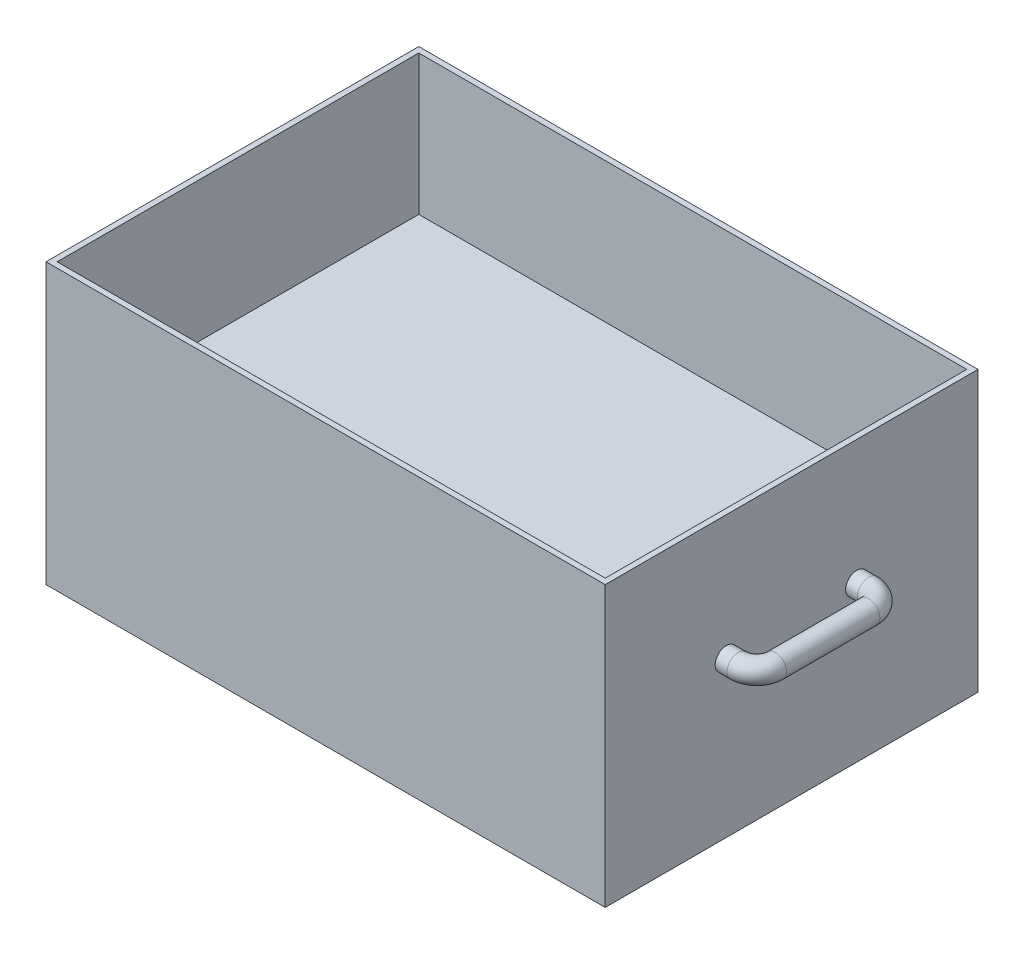
ISO-10303-21;
HEADER;
FILE_DESCRIPTION(('STEP AP214'),'2;1');
FILE_NAME('part.step','',(''),(''),'','','');
FILE_SCHEMA(('AUTOMOTIVE_DESIGN { 1 0 10303 214 1 1 1 1 }'));
ENDSEC;
DATA;
#1=APPLICATION_CONTEXT('core data for automotive mechanical design processes');
#2=APPLICATION_PROTOCOL_DEFINITION('international standard','automotive_design',2000,#1);
#3=PRODUCT_CONTEXT('',#1,'mechanical');
#4=PRODUCT('Part','Part','',(#3));
#5=PRODUCT_RELATED_PRODUCT_CATEGORY('part','',(#4));
#6=PRODUCT_DEFINITION_FORMATION('','',#4);
#7=PRODUCT_DEFINITION_CONTEXT('part definition',#1,'design');
#8=PRODUCT_DEFINITION('design','',#6,#7);
#9=PRODUCT_DEFINITION_SHAPE('','',#8);
#10=(LENGTH_UNIT() NAMED_UNIT(*) SI_UNIT(.MILLI.,.METRE.));
#11=(NAMED_UNIT(*) PLANE_ANGLE_UNIT() SI_UNIT($,.RADIAN.));
#12=(NAMED_UNIT(*) SI_UNIT($,.STERADIAN.) SOLID_ANGLE_UNIT());
#13=UNCERTAINTY_MEASURE_WITH_UNIT(LENGTH_MEASURE(1.E-05),#10,'distance_accuracy_value','');
#14=(GEOMETRIC_REPRESENTATION_CONTEXT(3) GLOBAL_UNCERTAINTY_ASSIGNED_CONTEXT((#13)) GLOBAL_UNIT_ASSIGNED_CONTEXT((#10,
#11,#12)) REPRESENTATION_CONTEXT('',''));
#15=CARTESIAN_POINT('',(0.,0.,0.));
#16=DIRECTION('',(0.,0.,1.));
#17=DIRECTION('',(1.,0.,0.));
#18=AXIS2_PLACEMENT_3D('',#15,#16,#17);
#19=CARTESIAN_POINT('',(163.179916317992,150.,-119.874476987448));
#20=DIRECTION('',(-1.,0.,0.));
#21=DIRECTION('',(0.,0.,1.));
#22=AXIS2_PLACEMENT_3D('',#19,#20,#21);
#23=PLANE('',#22);
#24=DIRECTION('',(0.,0.,-1.));
#25=VECTOR('',#24,1.);
#26=CARTESIAN_POINT('',(163.179916317992,0.,-119.874476987448));
#27=LINE('',#26,#25);
#28=CARTESIAN_POINT('',(163.179916317992,0.,80.1255230125523));
#29=VERTEX_POINT('',#28);
#30=CARTESIAN_POINT('',(163.179916317992,0.,-119.874476987448));
#31=VERTEX_POINT('',#30);
#32=EDGE_CURVE('E207',#29,#31,#27,.T.);
#33=ORIENTED_EDGE('',*,*,#32,.T.);
#34=DIRECTION('',(0.,-1.,0.));
#35=VECTOR('',#34,1.);
#36=CARTESIAN_POINT('',(163.179916317992,150.,-119.874476987448));
#37=LINE('',#36,#35);
#38=CARTESIAN_POINT('',(163.179916317992,150.,-119.874476987448));
#39=VERTEX_POINT('',#38);
#40=EDGE_CURVE('E212',#39,#31,#37,.T.);
#41=ORIENTED_EDGE('',*,*,#40,.F.);
#42=DIRECTION('',(0.,0.,-1.));
#43=VECTOR('',#42,1.);
#44=CARTESIAN_POINT('',(163.179916317992,150.,-119.874476987448));
#45=LINE('',#44,#43);
#46=CARTESIAN_POINT('',(163.179916317992,150.,80.1255230125523));
#47=VERTEX_POINT('',#46);
#48=EDGE_CURVE('E198',#47,#39,#45,.T.);
#49=ORIENTED_EDGE('',*,*,#48,.F.);
#50=DIRECTION('',(0.,-1.,0.));
#51=VECTOR('',#50,1.);
#52=CARTESIAN_POINT('',(163.179916317992,150.,80.1255230125523));
#53=LINE('',#52,#51);
#54=EDGE_CURVE('E214',#47,#29,#53,.T.);
#55=ORIENTED_EDGE('',*,*,#54,.T.);
#56=EDGE_LOOP('',(#33,#41,#49,#55));
#57=FACE_BOUND('',#56,.T.);
#58=CARTESIAN_POINT('',(163.179916317992,83.1723956839028,-54.8744769874478));
#59=DIRECTION('',(-1.,0.,0.));
#60=DIRECTION('',(0.,0.,1.));
#61=AXIS2_PLACEMENT_3D('',#58,#59,#60);
#62=CIRCLE('',#61,6.);
#63=CARTESIAN_POINT('',(163.179916317992,83.1723956839028,-48.8744769874478));
#64=VERTEX_POINT('',#63);
#65=EDGE_CURVE('E146',#64,#64,#62,.T.);
#66=ORIENTED_EDGE('',*,*,#65,.T.);
#67=EDGE_LOOP('',(#66));
#68=FACE_BOUND('',#67,.T.);
#69=CARTESIAN_POINT('',(163.179916317992,83.1723956839028,15.1255230125523));
#70=DIRECTION('',(1.,0.,0.));
#71=DIRECTION('',(0.,0.,-1.));
#72=AXIS2_PLACEMENT_3D('',#69,#70,#71);
#73=CIRCLE('',#72,6.);
#74=CARTESIAN_POINT('',(163.179916317992,83.1723956839028,9.12552301255226));
#75=VERTEX_POINT('',#74);
#76=EDGE_CURVE('E11',#75,#75,#73,.T.);
#77=ORIENTED_EDGE('',*,*,#76,.F.);
#78=EDGE_LOOP('',(#77));
#79=FACE_BOUND('',#78,.T.);
#80=ADVANCED_FACE('F33',(#57,#68,#79),#23,.F.);
#81=CARTESIAN_POINT('',(-136.820083682008,150.,-119.874476987448));
#82=DIRECTION('',(1.,0.,0.));
#83=DIRECTION('',(0.,0.,-1.));
#84=AXIS2_PLACEMENT_3D('',#81,#82,#83);
#85=PLANE('',#84);
#86=DIRECTION('',(0.,0.,1.));
#87=VECTOR('',#86,1.);
#88=CARTESIAN_POINT('',(-136.820083682008,0.,-119.874476987448));
#89=LINE('',#88,#87);
#90=CARTESIAN_POINT('',(-136.820083682008,0.,-119.874476987448));
#91=VERTEX_POINT('',#90);
#92=CARTESIAN_POINT('',(-136.820083682008,0.,80.1255230125523));
#93=VERTEX_POINT('',#92);
#94=EDGE_CURVE('E171',#91,#93,#89,.T.);
#95=ORIENTED_EDGE('',*,*,#94,.T.);
#96=DIRECTION('',(0.,-1.,0.));
#97=VECTOR('',#96,1.);
#98=CARTESIAN_POINT('',(-136.820083682008,150.,80.1255230125523));
#99=LINE('',#98,#97);
#100=CARTESIAN_POINT('',(-136.820083682008,150.,80.1255230125523));
#101=VERTEX_POINT('',#100);
#102=EDGE_CURVE('E37',#101,#93,#99,.T.);
#103=ORIENTED_EDGE('',*,*,#102,.F.);
#104=DIRECTION('',(0.,0.,1.));
#105=VECTOR('',#104,1.);
#106=CARTESIAN_POINT('',(-136.820083682008,150.,-119.874476987448));
#107=LINE('',#106,#105);
#108=CARTESIAN_POINT('',(-136.820083682008,150.,-119.874476987448));
#109=VERTEX_POINT('',#108);
#110=EDGE_CURVE('E192',#109,#101,#107,.T.);
#111=ORIENTED_EDGE('',*,*,#110,.F.);
#112=DIRECTION('',(0.,-1.,0.));
#113=VECTOR('',#112,1.);
#114=CARTESIAN_POINT('',(-136.820083682008,150.,-119.874476987448));
#115=LINE('',#114,#113);
#116=EDGE_CURVE('E202',#109,#91,#115,.T.);
#117=ORIENTED_EDGE('',*,*,#116,.T.);
#118=EDGE_LOOP('',(#95,#103,#111,#117));
#119=FACE_BOUND('',#118,.T.);
#120=ADVANCED_FACE('F35',(#119),#85,.F.);
#121=CARTESIAN_POINT('',(-136.820083682008,150.,80.1255230125523));
#122=DIRECTION('',(0.,0.,-1.));
#123=DIRECTION('',(-1.,0.,0.));
#124=AXIS2_PLACEMENT_3D('',#121,#122,#123);
#125=PLANE('',#124);
#126=DIRECTION('',(1.,0.,0.));
#127=VECTOR('',#126,1.);
#128=CARTESIAN_POINT('',(-136.820083682008,0.,80.1255230125523));
#129=LINE('',#128,#127);
#130=EDGE_CURVE('E205',#93,#29,#129,.T.);
#131=ORIENTED_EDGE('',*,*,#130,.T.);
#132=ORIENTED_EDGE('',*,*,#54,.F.);
#133=DIRECTION('',(1.,0.,0.));
#134=VECTOR('',#133,1.);
#135=CARTESIAN_POINT('',(-136.820083682008,150.,80.1255230125523));
#136=LINE('',#135,#134);
#137=EDGE_CURVE('E195',#101,#47,#136,.T.);
#138=ORIENTED_EDGE('',*,*,#137,.F.);
#139=ORIENTED_EDGE('',*,*,#102,.T.);
#140=EDGE_LOOP('',(#131,#132,#138,#139));
#141=FACE_BOUND('',#140,.T.);
#142=ADVANCED_FACE('F223',(#141),#125,.F.);
#143=CARTESIAN_POINT('',(-136.820083682008,150.,-119.874476987448));
#144=DIRECTION('',(0.,0.,1.));
#145=DIRECTION('',(1.,0.,0.));
#146=AXIS2_PLACEMENT_3D('',#143,#144,#145);
#147=PLANE('',#146);
#148=DIRECTION('',(-1.,0.,0.));
#149=VECTOR('',#148,1.);
#150=CARTESIAN_POINT('',(-136.820083682008,0.,-119.874476987448));
#151=LINE('',#150,#149);
#152=EDGE_CURVE('E196',#31,#91,#151,.T.);
#153=ORIENTED_EDGE('',*,*,#152,.T.);
#154=ORIENTED_EDGE('',*,*,#116,.F.);
#155=DIRECTION('',(-1.,0.,0.));
#156=VECTOR('',#155,1.);
#157=CARTESIAN_POINT('',(-136.820083682008,150.,-119.874476987448));
#158=LINE('',#157,#156);
#159=EDGE_CURVE('E200',#39,#109,#158,.T.);
#160=ORIENTED_EDGE('',*,*,#159,.F.);
#161=ORIENTED_EDGE('',*,*,#40,.T.);
#162=EDGE_LOOP('',(#153,#154,#160,#161));
#163=FACE_BOUND('',#162,.T.);
#164=ADVANCED_FACE('F233',(#163),#147,.F.);
#165=CARTESIAN_POINT('',(0.,150.,0.));
#166=DIRECTION('',(0.,1.,0.));
#167=DIRECTION('',(0.,0.,1.));
#168=AXIS2_PLACEMENT_3D('',#165,#166,#167);
#169=PLANE('',#168);
#170=DIRECTION('',(0.,0.,1.));
#171=VECTOR('',#170,1.);
#172=CARTESIAN_POINT('',(-133.820083682008,150.,-119.874476987448));
#173=LINE('',#172,#171);
#174=CARTESIAN_POINT('',(-133.820083682008,150.,-116.874476987448));
#175=VERTEX_POINT('',#174);
#176=CARTESIAN_POINT('',(-133.820083682008,150.,77.1255230125523));
#177=VERTEX_POINT('',#176);
#178=EDGE_CURVE('E185',#175,#177,#173,.T.);
#179=ORIENTED_EDGE('',*,*,#178,.F.);
#180=DIRECTION('',(-1.,0.,0.));
#181=VECTOR('',#180,1.);
#182=CARTESIAN_POINT('',(-136.820083682008,150.,-116.874476987448));
#183=LINE('',#182,#181);
#184=CARTESIAN_POINT('',(160.179916317992,150.,-116.874476987448));
#185=VERTEX_POINT('',#184);
#186=EDGE_CURVE('E176',#185,#175,#183,.T.);
#187=ORIENTED_EDGE('',*,*,#186,.F.);
#188=DIRECTION('',(0.,0.,-1.));
#189=VECTOR('',#188,1.);
#190=CARTESIAN_POINT('',(160.179916317992,150.,-119.874476987448));
#191=LINE('',#190,#189);
#192=CARTESIAN_POINT('',(160.179916317992,150.,77.1255230125523));
#193=VERTEX_POINT('',#192);
#194=EDGE_CURVE('E189',#193,#185,#191,.T.);
#195=ORIENTED_EDGE('',*,*,#194,.F.);
#196=DIRECTION('',(1.,0.,0.));
#197=VECTOR('',#196,1.);
#198=CARTESIAN_POINT('',(-136.820083682008,150.,77.1255230125523));
#199=LINE('',#198,#197);
#200=EDGE_CURVE('E187',#177,#193,#199,.T.);
#201=ORIENTED_EDGE('',*,*,#200,.F.);
#202=EDGE_LOOP('',(#179,#187,#195,#201));
#203=FACE_BOUND('',#202,.T.);
#204=ORIENTED_EDGE('',*,*,#110,.T.);
#205=ORIENTED_EDGE('',*,*,#137,.T.);
#206=ORIENTED_EDGE('',*,*,#48,.T.);
#207=ORIENTED_EDGE('',*,*,#159,.T.);
#208=EDGE_LOOP('',(#204,#205,#206,#207));
#209=FACE_BOUND('',#208,.T.);
#210=ADVANCED_FACE('F235',(#203,#209),#169,.T.);
#211=CARTESIAN_POINT('',(0.,0.,0.));
#212=DIRECTION('',(0.,1.,0.));
#213=DIRECTION('',(0.,0.,1.));
#214=AXIS2_PLACEMENT_3D('',#211,#212,#213);
#215=PLANE('',#214);
#216=DIRECTION('',(-1.,0.,0.));
#217=VECTOR('',#216,1.);
#218=CARTESIAN_POINT('',(-136.820083682008,0.,-116.874476987448));
#219=LINE('',#218,#217);
#220=CARTESIAN_POINT('',(160.179916317992,0.,-116.874476987448));
#221=VERTEX_POINT('',#220);
#222=CARTESIAN_POINT('',(-133.820083682008,0.,-116.874476987448));
#223=VERTEX_POINT('',#222);
#224=EDGE_CURVE('E130',#221,#223,#219,.T.);
#225=ORIENTED_EDGE('',*,*,#224,.T.);
#226=DIRECTION('',(0.,0.,1.));
#227=VECTOR('',#226,1.);
#228=CARTESIAN_POINT('',(-133.820083682008,0.,-119.874476987448));
#229=LINE('',#228,#227);
#230=CARTESIAN_POINT('',(-133.820083682008,0.,77.1255230125523));
#231=VERTEX_POINT('',#230);
#232=EDGE_CURVE('E138',#223,#231,#229,.T.);
#233=ORIENTED_EDGE('',*,*,#232,.T.);
#234=DIRECTION('',(1.,0.,0.));
#235=VECTOR('',#234,1.);
#236=CARTESIAN_POINT('',(-136.820083682008,0.,77.1255230125523));
#237=LINE('',#236,#235);
#238=CARTESIAN_POINT('',(160.179916317992,0.,77.1255230125523));
#239=VERTEX_POINT('',#238);
#240=EDGE_CURVE('E145',#231,#239,#237,.T.);
#241=ORIENTED_EDGE('',*,*,#240,.T.);
#242=DIRECTION('',(0.,0.,-1.));
#243=VECTOR('',#242,1.);
#244=CARTESIAN_POINT('',(160.179916317992,0.,-119.874476987448));
#245=LINE('',#244,#243);
#246=EDGE_CURVE('E49',#239,#221,#245,.T.);
#247=ORIENTED_EDGE('',*,*,#246,.T.);
#248=EDGE_LOOP('',(#225,#233,#241,#247));
#249=FACE_BOUND('',#248,.T.);
#250=ORIENTED_EDGE('',*,*,#94,.F.);
#251=ORIENTED_EDGE('',*,*,#152,.F.);
#252=ORIENTED_EDGE('',*,*,#32,.F.);
#253=ORIENTED_EDGE('',*,*,#130,.F.);
#254=EDGE_LOOP('',(#250,#251,#252,#253));
#255=FACE_BOUND('',#254,.T.);
#256=ADVANCED_FACE('F148',(#249,#255),#215,.F.);
#257=CARTESIAN_POINT('',(-133.820083682008,150.,-119.874476987448));
#258=DIRECTION('',(1.,0.,0.));
#259=DIRECTION('',(0.,0.,-1.));
#260=AXIS2_PLACEMENT_3D('',#257,#258,#259);
#261=PLANE('',#260);
#262=DIRECTION('',(0.,0.,1.));
#263=VECTOR('',#262,1.);
#264=CARTESIAN_POINT('',(-133.820083682008,75.,-119.874476987448));
#265=LINE('',#264,#263);
#266=CARTESIAN_POINT('',(-133.820083682008,75.,-116.874476987448));
#267=VERTEX_POINT('',#266);
#268=CARTESIAN_POINT('',(-133.820083682008,75.,77.1255230125523));
#269=VERTEX_POINT('',#268);
#270=EDGE_CURVE('E164',#267,#269,#265,.T.);
#271=ORIENTED_EDGE('',*,*,#270,.F.);
#272=DIRECTION('',(0.,-1.,0.));
#273=VECTOR('',#272,1.);
#274=CARTESIAN_POINT('',(-133.820083682008,150.,-116.874476987448));
#275=LINE('',#274,#273);
#276=EDGE_CURVE('E173',#175,#267,#275,.T.);
#277=ORIENTED_EDGE('',*,*,#276,.F.);
#278=ORIENTED_EDGE('',*,*,#178,.T.);
#279=DIRECTION('',(0.,-1.,0.));
#280=VECTOR('',#279,1.);
#281=CARTESIAN_POINT('',(-133.820083682008,150.,77.1255230125523));
#282=LINE('',#281,#280);
#283=EDGE_CURVE('E168',#177,#269,#282,.T.);
#284=ORIENTED_EDGE('',*,*,#283,.T.);
#285=EDGE_LOOP('',(#271,#277,#278,#284));
#286=FACE_BOUND('',#285,.T.);
#287=ADVANCED_FACE('F243',(#286),#261,.T.);
#288=CARTESIAN_POINT('',(-136.820083682008,150.,77.1255230125523));
#289=DIRECTION('',(0.,0.,-1.));
#290=DIRECTION('',(-1.,0.,0.));
#291=AXIS2_PLACEMENT_3D('',#288,#289,#290);
#292=PLANE('',#291);
#293=DIRECTION('',(1.,0.,0.));
#294=VECTOR('',#293,1.);
#295=CARTESIAN_POINT('',(-136.820083682008,75.,77.1255230125523));
#296=LINE('',#295,#294);
#297=CARTESIAN_POINT('',(160.179916317992,75.,77.1255230125523));
#298=VERTEX_POINT('',#297);
#299=EDGE_CURVE('E167',#269,#298,#296,.T.);
#300=ORIENTED_EDGE('',*,*,#299,.F.);
#301=ORIENTED_EDGE('',*,*,#283,.F.);
#302=ORIENTED_EDGE('',*,*,#200,.T.);
#303=DIRECTION('',(0.,-1.,0.));
#304=VECTOR('',#303,1.);
#305=CARTESIAN_POINT('',(160.179916317992,150.,77.1255230125523));
#306=LINE('',#305,#304);
#307=EDGE_CURVE('E172',#193,#298,#306,.T.);
#308=ORIENTED_EDGE('',*,*,#307,.T.);
#309=EDGE_LOOP('',(#300,#301,#302,#308));
#310=FACE_BOUND('',#309,.T.);
#311=ADVANCED_FACE('F276',(#310),#292,.T.);
#312=CARTESIAN_POINT('',(160.179916317992,150.,-119.874476987448));
#313=DIRECTION('',(-1.,0.,0.));
#314=DIRECTION('',(0.,0.,1.));
#315=AXIS2_PLACEMENT_3D('',#312,#313,#314);
#316=PLANE('',#315);
#317=DIRECTION('',(0.,0.,-1.));
#318=VECTOR('',#317,1.);
#319=CARTESIAN_POINT('',(160.179916317992,75.,-119.874476987448));
#320=LINE('',#319,#318);
#321=CARTESIAN_POINT('',(160.179916317992,75.,-116.874476987448));
#322=VERTEX_POINT('',#321);
#323=EDGE_CURVE('E178',#298,#322,#320,.T.);
#324=ORIENTED_EDGE('',*,*,#323,.F.);
#325=ORIENTED_EDGE('',*,*,#307,.F.);
#326=ORIENTED_EDGE('',*,*,#194,.T.);
#327=DIRECTION('',(0.,-1.,0.));
#328=VECTOR('',#327,1.);
#329=CARTESIAN_POINT('',(160.179916317992,150.,-116.874476987448));
#330=LINE('',#329,#328);
#331=EDGE_CURVE('E57',#185,#322,#330,.T.);
#332=ORIENTED_EDGE('',*,*,#331,.T.);
#333=EDGE_LOOP('',(#324,#325,#326,#332));
#334=FACE_BOUND('',#333,.T.);
#335=ADVANCED_FACE('F286',(#334),#316,.T.);
#336=CARTESIAN_POINT('',(-136.820083682008,150.,-116.874476987448));
#337=DIRECTION('',(0.,0.,1.));
#338=DIRECTION('',(1.,0.,0.));
#339=AXIS2_PLACEMENT_3D('',#336,#337,#338);
#340=PLANE('',#339);
#341=DIRECTION('',(-1.,0.,0.));
#342=VECTOR('',#341,1.);
#343=CARTESIAN_POINT('',(-136.820083682008,75.,-116.874476987448));
#344=LINE('',#343,#342);
#345=EDGE_CURVE('E182',#322,#267,#344,.T.);
#346=ORIENTED_EDGE('',*,*,#345,.F.);
#347=ORIENTED_EDGE('',*,*,#331,.F.);
#348=ORIENTED_EDGE('',*,*,#186,.T.);
#349=ORIENTED_EDGE('',*,*,#276,.T.);
#350=EDGE_LOOP('',(#346,#347,#348,#349));
#351=FACE_BOUND('',#350,.T.);
#352=ADVANCED_FACE('F296',(#351),#340,.T.);
#353=CARTESIAN_POINT('',(0.,75.,0.));
#354=DIRECTION('',(0.,1.,0.));
#355=DIRECTION('',(0.,0.,1.));
#356=AXIS2_PLACEMENT_3D('',#353,#354,#355);
#357=PLANE('',#356);
#358=ORIENTED_EDGE('',*,*,#270,.T.);
#359=ORIENTED_EDGE('',*,*,#299,.T.);
#360=ORIENTED_EDGE('',*,*,#323,.T.);
#361=ORIENTED_EDGE('',*,*,#345,.T.);
#362=EDGE_LOOP('',(#358,#359,#360,#361));
#363=FACE_BOUND('',#362,.T.);
#364=ADVANCED_FACE('F306',(#363),#357,.T.);
#365=CARTESIAN_POINT('',(0.,72.,0.));
#366=DIRECTION('',(0.,1.,0.));
#367=DIRECTION('',(0.,0.,1.));
#368=AXIS2_PLACEMENT_3D('',#365,#366,#367);
#369=PLANE('',#368);
#370=DIRECTION('',(0.,0.,-1.));
#371=VECTOR('',#370,1.);
#372=CARTESIAN_POINT('',(160.179916317992,72.,-119.874476987448));
#373=LINE('',#372,#371);
#374=CARTESIAN_POINT('',(160.179916317992,72.,77.1255230125523));
#375=VERTEX_POINT('',#374);
#376=CARTESIAN_POINT('',(160.179916317992,72.,-116.874476987448));
#377=VERTEX_POINT('',#376);
#378=EDGE_CURVE('E160',#375,#377,#373,.T.);
#379=ORIENTED_EDGE('',*,*,#378,.F.);
#380=DIRECTION('',(1.,0.,0.));
#381=VECTOR('',#380,1.);
#382=CARTESIAN_POINT('',(-136.820083682008,72.,77.1255230125523));
#383=LINE('',#382,#381);
#384=CARTESIAN_POINT('',(-133.820083682008,72.,77.1255230125523));
#385=VERTEX_POINT('',#384);
#386=EDGE_CURVE('E157',#385,#375,#383,.T.);
#387=ORIENTED_EDGE('',*,*,#386,.F.);
#388=DIRECTION('',(0.,0.,1.));
#389=VECTOR('',#388,1.);
#390=CARTESIAN_POINT('',(-133.820083682008,72.,-119.874476987448));
#391=LINE('',#390,#389);
#392=CARTESIAN_POINT('',(-133.820083682008,72.,-116.874476987448));
#393=VERTEX_POINT('',#392);
#394=EDGE_CURVE('E155',#393,#385,#391,.T.);
#395=ORIENTED_EDGE('',*,*,#394,.F.);
#396=DIRECTION('',(-1.,0.,0.));
#397=VECTOR('',#396,1.);
#398=CARTESIAN_POINT('',(-136.820083682008,72.,-116.874476987448));
#399=LINE('',#398,#397);
#400=EDGE_CURVE('E131',#377,#393,#399,.T.);
#401=ORIENTED_EDGE('',*,*,#400,.F.);
#402=EDGE_LOOP('',(#379,#387,#395,#401));
#403=FACE_BOUND('',#402,.T.);
#404=ADVANCED_FACE('F315',(#403),#369,.F.);
#405=CARTESIAN_POINT('',(-133.820083682008,150.,-119.874476987448));
#406=DIRECTION('',(1.,0.,0.));
#407=DIRECTION('',(0.,0.,-1.));
#408=AXIS2_PLACEMENT_3D('',#405,#406,#407);
#409=PLANE('',#408);
#410=ORIENTED_EDGE('',*,*,#394,.T.);
#411=DIRECTION('',(0.,-1.,0.));
#412=VECTOR('',#411,1.);
#413=CARTESIAN_POINT('',(-133.820083682008,150.,77.1255230125523));
#414=LINE('',#413,#412);
#415=EDGE_CURVE('E141',#385,#231,#414,.T.);
#416=ORIENTED_EDGE('',*,*,#415,.T.);
#417=ORIENTED_EDGE('',*,*,#232,.F.);
#418=DIRECTION('',(0.,-1.,0.));
#419=VECTOR('',#418,1.);
#420=CARTESIAN_POINT('',(-133.820083682008,150.,-116.874476987448));
#421=LINE('',#420,#419);
#422=EDGE_CURVE('E125',#393,#223,#421,.T.);
#423=ORIENTED_EDGE('',*,*,#422,.F.);
#424=EDGE_LOOP('',(#410,#416,#417,#423));
#425=FACE_BOUND('',#424,.T.);
#426=ADVANCED_FACE('F139',(#425),#409,.T.);
#427=CARTESIAN_POINT('',(-136.820083682008,150.,77.1255230125523));
#428=DIRECTION('',(0.,0.,-1.));
#429=DIRECTION('',(-1.,0.,0.));
#430=AXIS2_PLACEMENT_3D('',#427,#428,#429);
#431=PLANE('',#430);
#432=ORIENTED_EDGE('',*,*,#386,.T.);
#433=DIRECTION('',(0.,-1.,0.));
#434=VECTOR('',#433,1.);
#435=CARTESIAN_POINT('',(160.179916317992,150.,77.1255230125523));
#436=LINE('',#435,#434);
#437=EDGE_CURVE('E441',#375,#239,#436,.T.);
#438=ORIENTED_EDGE('',*,*,#437,.T.);
#439=ORIENTED_EDGE('',*,*,#240,.F.);
#440=ORIENTED_EDGE('',*,*,#415,.F.);
#441=EDGE_LOOP('',(#432,#438,#439,#440));
#442=FACE_BOUND('',#441,.T.);
#443=ADVANCED_FACE('F340',(#442),#431,.T.);
#444=CARTESIAN_POINT('',(160.179916317992,150.,-119.874476987448));
#445=DIRECTION('',(-1.,0.,0.));
#446=DIRECTION('',(0.,0.,1.));
#447=AXIS2_PLACEMENT_3D('',#444,#445,#446);
#448=PLANE('',#447);
#449=ORIENTED_EDGE('',*,*,#378,.T.);
#450=DIRECTION('',(0.,-1.,0.));
#451=VECTOR('',#450,1.);
#452=CARTESIAN_POINT('',(160.179916317992,150.,-116.874476987448));
#453=LINE('',#452,#451);
#454=EDGE_CURVE('E135',#377,#221,#453,.T.);
#455=ORIENTED_EDGE('',*,*,#454,.T.);
#456=ORIENTED_EDGE('',*,*,#246,.F.);
#457=ORIENTED_EDGE('',*,*,#437,.F.);
#458=EDGE_LOOP('',(#449,#455,#456,#457));
#459=FACE_BOUND('',#458,.T.);
#460=ADVANCED_FACE('F349',(#459),#448,.T.);
#461=CARTESIAN_POINT('',(-136.820083682008,150.,-116.874476987448));
#462=DIRECTION('',(0.,0.,1.));
#463=DIRECTION('',(1.,0.,0.));
#464=AXIS2_PLACEMENT_3D('',#461,#462,#463);
#465=PLANE('',#464);
#466=ORIENTED_EDGE('',*,*,#400,.T.);
#467=ORIENTED_EDGE('',*,*,#422,.T.);
#468=ORIENTED_EDGE('',*,*,#224,.F.);
#469=ORIENTED_EDGE('',*,*,#454,.F.);
#470=EDGE_LOOP('',(#466,#467,#468,#469));
#471=FACE_BOUND('',#470,.T.);
#472=ADVANCED_FACE('F127',(#471),#465,.T.);
#473=CARTESIAN_POINT('',(169.565605173622,83.1723956839028,-54.8744769874478));
#474=DIRECTION('',(-1.,0.,0.));
#475=DIRECTION('',(0.,0.,1.));
#476=AXIS2_PLACEMENT_3D('',#473,#474,#475);
#477=CYLINDRICAL_SURFACE('',#476,6.);
#478=CARTESIAN_POINT('',(169.565605173622,83.1723956839028,-54.8744769874478));
#479=DIRECTION('',(-1.,0.,0.));
#480=DIRECTION('',(0.,0.,1.));
#481=AXIS2_PLACEMENT_3D('',#478,#479,#480);
#482=CIRCLE('',#481,6.);
#483=CARTESIAN_POINT('',(169.565605173622,83.1723956839028,-60.8744769874478));
#484=VERTEX_POINT('',#483);
#485=EDGE_CURVE('E436',#484,#484,#482,.T.);
#486=ORIENTED_EDGE('',*,*,#485,.T.);
#487=EDGE_LOOP('',(#486));
#488=FACE_BOUND('',#487,.T.);
#489=ORIENTED_EDGE('',*,*,#65,.F.);
#490=EDGE_LOOP('',(#489));
#491=FACE_BOUND('',#490,.T.);
#492=ADVANCED_FACE('F365',(#488,#491),#477,.T.);
#493=CARTESIAN_POINT('',(169.565605173622,83.1723956839028,-44.8744769874477));
#494=DIRECTION('',(0.,1.,0.));
#495=DIRECTION('',(0.,0.,1.));
#496=AXIS2_PLACEMENT_3D('',#493,#494,#495);
#497=TOROIDAL_SURFACE('',#496,10.,6.);
#498=CARTESIAN_POINT('',(179.565605173622,83.1723956839028,-44.8744769874477));
#499=DIRECTION('',(0.,0.,-1.));
#500=DIRECTION('',(-1.,0.,0.));
#501=AXIS2_PLACEMENT_3D('',#498,#499,#500);
#502=CIRCLE('',#501,6.);
#503=CARTESIAN_POINT('',(185.565605173622,83.1723956839028,-44.8744769874477));
#504=VERTEX_POINT('',#503);
#505=EDGE_CURVE('E431',#504,#504,#502,.T.);
#506=CARTESIAN_POINT('',(169.565605173622,83.1723956839028,-44.8744769874477));
#507=DIRECTION('',(0.,1.,0.));
#508=DIRECTION('',(0.,0.,1.));
#509=AXIS2_PLACEMENT_3D('',#506,#507,#508);
#510=CIRCLE('',#509,16.);
#511=EDGE_CURVE('',#504,#484,#510,.T.);
#512=ORIENTED_EDGE('',*,*,#505,.T.);
#513=ORIENTED_EDGE('',*,*,#485,.F.);
#514=ORIENTED_EDGE('',*,*,#511,.T.);
#515=ORIENTED_EDGE('',*,*,#511,.F.);
#516=EDGE_LOOP('',(#512,#514,#513,#515));
#517=FACE_BOUND('',#516,.T.);
#518=ADVANCED_FACE('F378',(#517),#497,.T.);
#519=CARTESIAN_POINT('',(179.565605173622,83.1723956839028,5.12552301255217));
#520=DIRECTION('',(0.,0.,-1.));
#521=DIRECTION('',(-1.,0.,0.));
#522=AXIS2_PLACEMENT_3D('',#519,#520,#521);
#523=CYLINDRICAL_SURFACE('',#522,6.);
#524=CARTESIAN_POINT('',(179.565605173622,83.1723956839028,5.12552301255217));
#525=DIRECTION('',(0.,0.,-1.));
#526=DIRECTION('',(-1.,0.,0.));
#527=AXIS2_PLACEMENT_3D('',#524,#525,#526);
#528=CIRCLE('',#527,6.);
#529=CARTESIAN_POINT('',(185.565605173622,83.1723956839028,5.12552301255212));
#530=VERTEX_POINT('',#529);
#531=EDGE_CURVE('E428',#530,#530,#528,.T.);
#532=ORIENTED_EDGE('',*,*,#531,.T.);
#533=EDGE_LOOP('',(#532));
#534=FACE_BOUND('',#533,.T.);
#535=ORIENTED_EDGE('',*,*,#505,.F.);
#536=EDGE_LOOP('',(#535));
#537=FACE_BOUND('',#536,.T.);
#538=ADVANCED_FACE('F388',(#534,#537),#523,.T.);
#539=CARTESIAN_POINT('',(169.565605173622,83.1723956839028,5.12552301255226));
#540=DIRECTION('',(0.,1.,0.));
#541=DIRECTION('',(0.,0.,1.));
#542=AXIS2_PLACEMENT_3D('',#539,#540,#541);
#543=TOROIDAL_SURFACE('',#542,10.,6.);
#544=CARTESIAN_POINT('',(169.565605173622,83.1723956839028,15.1255230125523));
#545=DIRECTION('',(1.,0.,0.));
#546=DIRECTION('',(0.,0.,-1.));
#547=AXIS2_PLACEMENT_3D('',#544,#545,#546);
#548=CIRCLE('',#547,6.);
#549=CARTESIAN_POINT('',(169.565605173622,83.1723956839028,21.1255230125523));
#550=VERTEX_POINT('',#549);
#551=EDGE_CURVE('E425',#550,#550,#548,.T.);
#552=CARTESIAN_POINT('',(169.565605173622,83.1723956839028,5.12552301255226));
#553=DIRECTION('',(0.,1.,0.));
#554=DIRECTION('',(0.,0.,1.));
#555=AXIS2_PLACEMENT_3D('',#552,#553,#554);
#556=CIRCLE('',#555,16.);
#557=EDGE_CURVE('',#550,#530,#556,.T.);
#558=ORIENTED_EDGE('',*,*,#551,.T.);
#559=ORIENTED_EDGE('',*,*,#531,.F.);
#560=ORIENTED_EDGE('',*,*,#557,.T.);
#561=ORIENTED_EDGE('',*,*,#557,.F.);
#562=EDGE_LOOP('',(#558,#560,#559,#561));
#563=FACE_BOUND('',#562,.T.);
#564=ADVANCED_FACE('F398',(#563),#543,.T.);
#565=CARTESIAN_POINT('',(169.565605173622,83.1723956839028,15.1255230125523));
#566=DIRECTION('',(-1.,0.,0.));
#567=DIRECTION('',(0.,0.,1.));
#568=AXIS2_PLACEMENT_3D('',#565,#566,#567);
#569=CYLINDRICAL_SURFACE('',#568,6.);
#570=ORIENTED_EDGE('',*,*,#551,.F.);
#571=EDGE_LOOP('',(#570));
#572=FACE_BOUND('',#571,.T.);
#573=ORIENTED_EDGE('',*,*,#76,.T.);
#574=EDGE_LOOP('',(#573));
#575=FACE_BOUND('',#574,.T.);
#576=ADVANCED_FACE('F408',(#572,#575),#569,.T.);
#577=CLOSED_SHELL('',(#80,#120,#142,#164,#210,#256,#287,#311,#335,#352,#364,#404,#426,#443,#460,
#472,#492,#518,#538,#564,#576));
#578=MANIFOLD_SOLID_BREP('B2',#577);
#579=ADVANCED_BREP_SHAPE_REPRESENTATION('',(#18,#578),#14);
#580=SHAPE_DEFINITION_REPRESENTATION(#9,#579);
ENDSEC;
END-ISO-10303-21;
